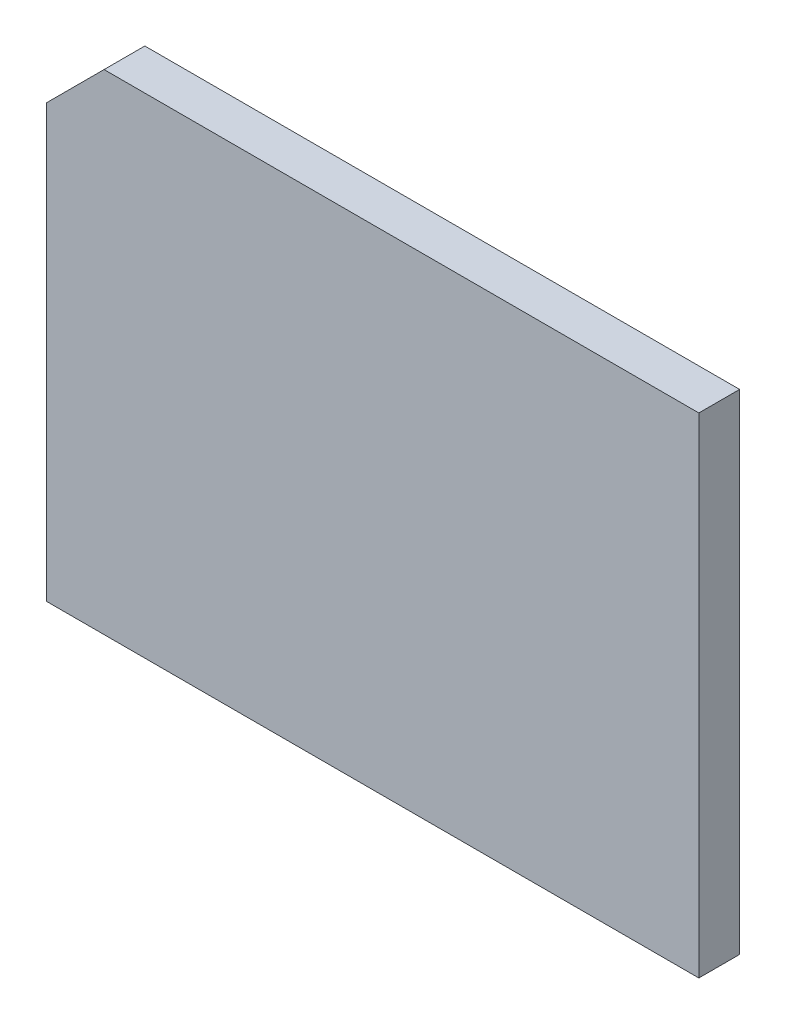
ISO-10303-21;
HEADER;
FILE_DESCRIPTION(('STEP AP214'),'2;1');
FILE_NAME('part.step','',(''),(''),'','','');
FILE_SCHEMA(('AUTOMOTIVE_DESIGN { 1 0 10303 214 1 1 1 1 }'));
ENDSEC;
DATA;
#1=APPLICATION_CONTEXT('core data for automotive mechanical design processes');
#2=APPLICATION_PROTOCOL_DEFINITION('international standard','automotive_design',2000,#1);
#3=PRODUCT_CONTEXT('',#1,'mechanical');
#4=PRODUCT('Part','Part','',(#3));
#5=PRODUCT_RELATED_PRODUCT_CATEGORY('part','',(#4));
#6=PRODUCT_DEFINITION_FORMATION('','',#4);
#7=PRODUCT_DEFINITION_CONTEXT('part definition',#1,'design');
#8=PRODUCT_DEFINITION('design','',#6,#7);
#9=PRODUCT_DEFINITION_SHAPE('','',#8);
#10=(LENGTH_UNIT() NAMED_UNIT(*) SI_UNIT(.MILLI.,.METRE.));
#11=(NAMED_UNIT(*) PLANE_ANGLE_UNIT() SI_UNIT($,.RADIAN.));
#12=(NAMED_UNIT(*) SI_UNIT($,.STERADIAN.) SOLID_ANGLE_UNIT());
#13=UNCERTAINTY_MEASURE_WITH_UNIT(LENGTH_MEASURE(1.E-05),#10,'distance_accuracy_value','');
#14=(GEOMETRIC_REPRESENTATION_CONTEXT(3) GLOBAL_UNCERTAINTY_ASSIGNED_CONTEXT((#13)) GLOBAL_UNIT_ASSIGNED_CONTEXT((#10,
#11,#12)) REPRESENTATION_CONTEXT('',''));
#15=CARTESIAN_POINT('',(0.,0.,0.));
#16=DIRECTION('',(0.,0.,1.));
#17=DIRECTION('',(1.,0.,0.));
#18=AXIS2_PLACEMENT_3D('',#15,#16,#17);
#19=CARTESIAN_POINT('',(15.24,-11.43,1.905));
#20=DIRECTION('',(-1.,0.,0.));
#21=DIRECTION('',(0.,0.,1.));
#22=AXIS2_PLACEMENT_3D('',#19,#20,#21);
#23=PLANE('',#22);
#24=DIRECTION('',(0.,1.,0.));
#25=VECTOR('',#24,1.);
#26=CARTESIAN_POINT('',(15.24,-11.43,0.));
#27=LINE('',#26,#25);
#28=CARTESIAN_POINT('',(15.24,-11.43,0.));
#29=VERTEX_POINT('',#28);
#30=CARTESIAN_POINT('',(15.24,11.43,0.));
#31=VERTEX_POINT('',#30);
#32=EDGE_CURVE('E107',#29,#31,#27,.T.);
#33=ORIENTED_EDGE('',*,*,#32,.T.);
#34=DIRECTION('',(0.,0.,-1.));
#35=VECTOR('',#34,1.);
#36=CARTESIAN_POINT('',(15.24,11.43,1.905));
#37=LINE('',#36,#35);
#38=CARTESIAN_POINT('',(15.24,11.43,1.905));
#39=VERTEX_POINT('',#38);
#40=EDGE_CURVE('E11',#39,#31,#37,.T.);
#41=ORIENTED_EDGE('',*,*,#40,.F.);
#42=DIRECTION('',(0.,1.,0.));
#43=VECTOR('',#42,1.);
#44=CARTESIAN_POINT('',(15.24,-11.43,1.905));
#45=LINE('',#44,#43);
#46=CARTESIAN_POINT('',(15.24,-11.43,1.905));
#47=VERTEX_POINT('',#46);
#48=EDGE_CURVE('E115',#47,#39,#45,.T.);
#49=ORIENTED_EDGE('',*,*,#48,.F.);
#50=DIRECTION('',(0.,0.,-1.));
#51=VECTOR('',#50,1.);
#52=CARTESIAN_POINT('',(15.24,-11.43,1.905));
#53=LINE('',#52,#51);
#54=EDGE_CURVE('E103',#47,#29,#53,.T.);
#55=ORIENTED_EDGE('',*,*,#54,.T.);
#56=EDGE_LOOP('',(#33,#41,#49,#55));
#57=FACE_BOUND('',#56,.T.);
#58=ADVANCED_FACE('F33',(#57),#23,.F.);
#59=CARTESIAN_POINT('',(-12.5459231636792,11.43,1.905));
#60=DIRECTION('',(0.,-1.,0.));
#61=DIRECTION('',(0.,0.,-1.));
#62=AXIS2_PLACEMENT_3D('',#59,#60,#61);
#63=PLANE('',#62);
#64=DIRECTION('',(-1.,0.,0.));
#65=VECTOR('',#64,1.);
#66=CARTESIAN_POINT('',(-12.5459231636792,11.43,0.));
#67=LINE('',#66,#65);
#68=CARTESIAN_POINT('',(-12.5459231636792,11.43,0.));
#69=VERTEX_POINT('',#68);
#70=EDGE_CURVE('E110',#31,#69,#67,.T.);
#71=ORIENTED_EDGE('',*,*,#70,.T.);
#72=DIRECTION('',(0.,0.,-1.));
#73=VECTOR('',#72,1.);
#74=CARTESIAN_POINT('',(-12.5459231636792,11.43,1.905));
#75=LINE('',#74,#73);
#76=CARTESIAN_POINT('',(-12.5459231636792,11.43,1.905));
#77=VERTEX_POINT('',#76);
#78=EDGE_CURVE('E41',#77,#69,#75,.T.);
#79=ORIENTED_EDGE('',*,*,#78,.F.);
#80=DIRECTION('',(-1.,0.,0.));
#81=VECTOR('',#80,1.);
#82=CARTESIAN_POINT('',(-12.5459231636792,11.43,1.905));
#83=LINE('',#82,#81);
#84=EDGE_CURVE('E83',#39,#77,#83,.T.);
#85=ORIENTED_EDGE('',*,*,#84,.F.);
#86=ORIENTED_EDGE('',*,*,#40,.T.);
#87=EDGE_LOOP('',(#71,#79,#85,#86));
#88=FACE_BOUND('',#87,.T.);
#89=ADVANCED_FACE('F134',(#88),#63,.F.);
#90=CARTESIAN_POINT('',(-15.24,8.73592316367927,1.905));
#91=DIRECTION('',(0.707106781186546,-0.707106781186549,0.));
#92=DIRECTION('',(0.707106781186549,0.707106781186546,0.));
#93=AXIS2_PLACEMENT_3D('',#90,#91,#92);
#94=PLANE('',#93);
#95=DIRECTION('',(-0.707106781186549,-0.707106781186546,0.));
#96=VECTOR('',#95,1.);
#97=CARTESIAN_POINT('',(-15.24,8.73592316367927,0.));
#98=LINE('',#97,#96);
#99=CARTESIAN_POINT('',(-15.24,8.73592316367927,0.));
#100=VERTEX_POINT('',#99);
#101=EDGE_CURVE('E98',#69,#100,#98,.T.);
#102=ORIENTED_EDGE('',*,*,#101,.T.);
#103=DIRECTION('',(0.,0.,-1.));
#104=VECTOR('',#103,1.);
#105=CARTESIAN_POINT('',(-15.24,8.73592316367927,1.905));
#106=LINE('',#105,#104);
#107=CARTESIAN_POINT('',(-15.24,8.73592316367927,1.905));
#108=VERTEX_POINT('',#107);
#109=EDGE_CURVE('E95',#108,#100,#106,.T.);
#110=ORIENTED_EDGE('',*,*,#109,.F.);
#111=DIRECTION('',(-0.707106781186549,-0.707106781186546,0.));
#112=VECTOR('',#111,1.);
#113=CARTESIAN_POINT('',(-15.24,8.73592316367927,1.905));
#114=LINE('',#113,#112);
#115=EDGE_CURVE('E87',#77,#108,#114,.T.);
#116=ORIENTED_EDGE('',*,*,#115,.F.);
#117=ORIENTED_EDGE('',*,*,#78,.T.);
#118=EDGE_LOOP('',(#102,#110,#116,#117));
#119=FACE_BOUND('',#118,.T.);
#120=ADVANCED_FACE('F96',(#119),#94,.F.);
#121=CARTESIAN_POINT('',(-15.24,-11.43,1.905));
#122=DIRECTION('',(1.,0.,0.));
#123=DIRECTION('',(0.,1.,0.));
#124=AXIS2_PLACEMENT_3D('',#121,#122,#123);
#125=PLANE('',#124);
#126=DIRECTION('',(0.,-1.,0.));
#127=VECTOR('',#126,1.);
#128=CARTESIAN_POINT('',(-15.24,-11.43,0.));
#129=LINE('',#128,#127);
#130=CARTESIAN_POINT('',(-15.24,-11.43,0.));
#131=VERTEX_POINT('',#130);
#132=EDGE_CURVE('E69',#100,#131,#129,.T.);
#133=ORIENTED_EDGE('',*,*,#132,.T.);
#134=DIRECTION('',(0.,0.,-1.));
#135=VECTOR('',#134,1.);
#136=CARTESIAN_POINT('',(-15.24,-11.43,1.905));
#137=LINE('',#136,#135);
#138=CARTESIAN_POINT('',(-15.24,-11.43,1.905));
#139=VERTEX_POINT('',#138);
#140=EDGE_CURVE('E99',#139,#131,#137,.T.);
#141=ORIENTED_EDGE('',*,*,#140,.F.);
#142=DIRECTION('',(0.,-1.,0.));
#143=VECTOR('',#142,1.);
#144=CARTESIAN_POINT('',(-15.24,-11.43,1.905));
#145=LINE('',#144,#143);
#146=EDGE_CURVE('E91',#108,#139,#145,.T.);
#147=ORIENTED_EDGE('',*,*,#146,.F.);
#148=ORIENTED_EDGE('',*,*,#109,.T.);
#149=EDGE_LOOP('',(#133,#141,#147,#148));
#150=FACE_BOUND('',#149,.T.);
#151=ADVANCED_FACE('F101',(#150),#125,.F.);
#152=CARTESIAN_POINT('',(-15.24,-11.43,1.905));
#153=DIRECTION('',(0.,1.,0.));
#154=DIRECTION('',(0.,0.,1.));
#155=AXIS2_PLACEMENT_3D('',#152,#153,#154);
#156=PLANE('',#155);
#157=DIRECTION('',(1.,0.,0.));
#158=VECTOR('',#157,1.);
#159=CARTESIAN_POINT('',(-15.24,-11.43,0.));
#160=LINE('',#159,#158);
#161=EDGE_CURVE('E75',#131,#29,#160,.T.);
#162=ORIENTED_EDGE('',*,*,#161,.T.);
#163=ORIENTED_EDGE('',*,*,#54,.F.);
#164=DIRECTION('',(1.,0.,0.));
#165=VECTOR('',#164,1.);
#166=CARTESIAN_POINT('',(-15.24,-11.43,1.905));
#167=LINE('',#166,#165);
#168=EDGE_CURVE('E49',#139,#47,#167,.T.);
#169=ORIENTED_EDGE('',*,*,#168,.F.);
#170=ORIENTED_EDGE('',*,*,#140,.T.);
#171=EDGE_LOOP('',(#162,#163,#169,#170));
#172=FACE_BOUND('',#171,.T.);
#173=ADVANCED_FACE('F123',(#172),#156,.F.);
#174=CARTESIAN_POINT('',(15.24,11.43,1.905));
#175=DIRECTION('',(0.,0.,-1.));
#176=DIRECTION('',(-1.,0.,0.));
#177=AXIS2_PLACEMENT_3D('',#174,#175,#176);
#178=PLANE('',#177);
#179=ORIENTED_EDGE('',*,*,#48,.T.);
#180=ORIENTED_EDGE('',*,*,#84,.T.);
#181=ORIENTED_EDGE('',*,*,#115,.T.);
#182=ORIENTED_EDGE('',*,*,#146,.T.);
#183=ORIENTED_EDGE('',*,*,#168,.T.);
#184=EDGE_LOOP('',(#179,#180,#181,#182,#183));
#185=FACE_BOUND('',#184,.T.);
#186=ADVANCED_FACE('F89',(#185),#178,.F.);
#187=CARTESIAN_POINT('',(15.24,11.43,0.));
#188=DIRECTION('',(0.,0.,-1.));
#189=DIRECTION('',(-1.,0.,0.));
#190=AXIS2_PLACEMENT_3D('',#187,#188,#189);
#191=PLANE('',#190);
#192=ORIENTED_EDGE('',*,*,#32,.F.);
#193=ORIENTED_EDGE('',*,*,#161,.F.);
#194=ORIENTED_EDGE('',*,*,#132,.F.);
#195=ORIENTED_EDGE('',*,*,#101,.F.);
#196=ORIENTED_EDGE('',*,*,#70,.F.);
#197=EDGE_LOOP('',(#192,#193,#194,#195,#196));
#198=FACE_BOUND('',#197,.T.);
#199=ADVANCED_FACE('F119',(#198),#191,.T.);
#200=CLOSED_SHELL('',(#58,#89,#120,#151,#173,#186,#199));
#201=MANIFOLD_SOLID_BREP('B2',#200);
#202=ADVANCED_BREP_SHAPE_REPRESENTATION('',(#18,#201),#14);
#203=SHAPE_DEFINITION_REPRESENTATION(#9,#202);
ENDSEC;
END-ISO-10303-21;
